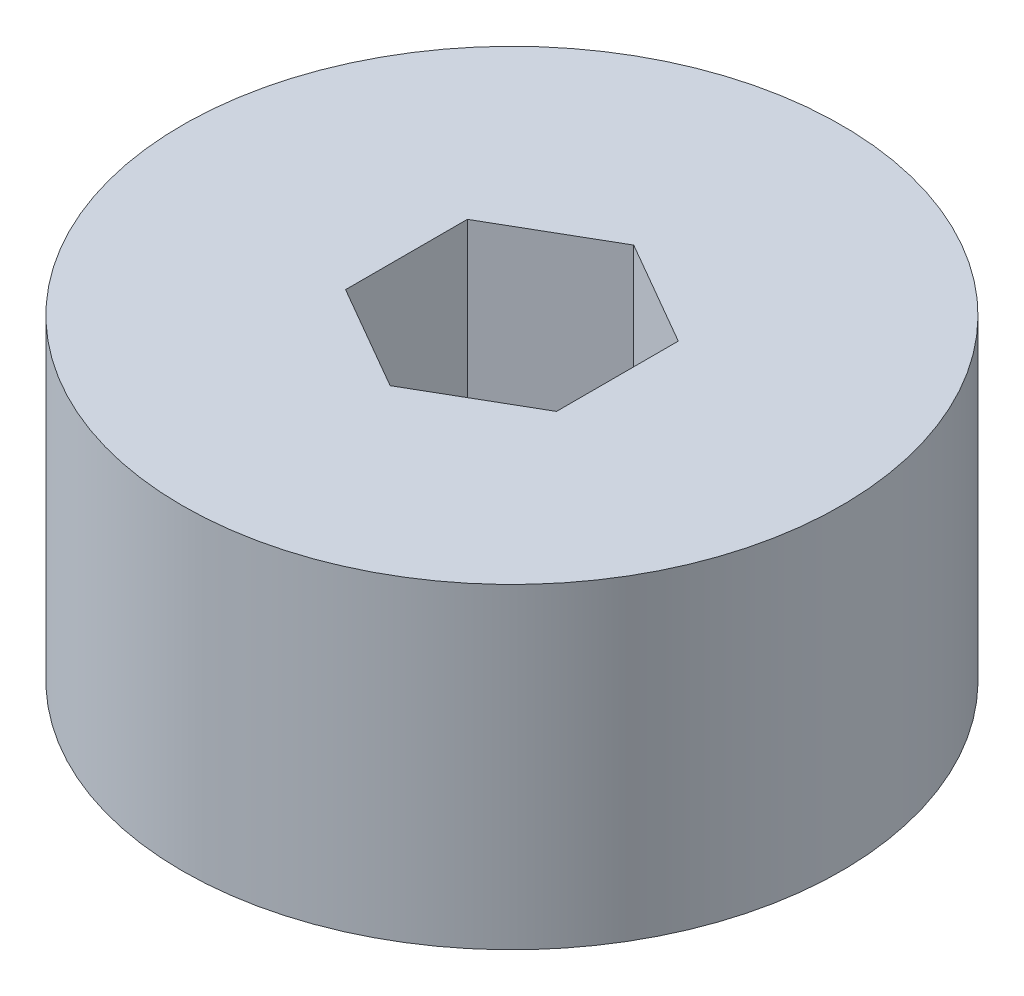
ISO-10303-21;
HEADER;
FILE_DESCRIPTION(('STEP AP214'),'2;1');
FILE_NAME('part.step','',(''),(''),'','','');
FILE_SCHEMA(('AUTOMOTIVE_DESIGN { 1 0 10303 214 1 1 1 1 }'));
ENDSEC;
DATA;
#1=APPLICATION_CONTEXT('core data for automotive mechanical design processes');
#2=APPLICATION_PROTOCOL_DEFINITION('international standard','automotive_design',2000,#1);
#3=PRODUCT_CONTEXT('',#1,'mechanical');
#4=PRODUCT('Part','Part','',(#3));
#5=PRODUCT_RELATED_PRODUCT_CATEGORY('part','',(#4));
#6=PRODUCT_DEFINITION_FORMATION('','',#4);
#7=PRODUCT_DEFINITION_CONTEXT('part definition',#1,'design');
#8=PRODUCT_DEFINITION('design','',#6,#7);
#9=PRODUCT_DEFINITION_SHAPE('','',#8);
#10=(LENGTH_UNIT() NAMED_UNIT(*) SI_UNIT(.MILLI.,.METRE.));
#11=(NAMED_UNIT(*) PLANE_ANGLE_UNIT() SI_UNIT($,.RADIAN.));
#12=(NAMED_UNIT(*) SI_UNIT($,.STERADIAN.) SOLID_ANGLE_UNIT());
#13=UNCERTAINTY_MEASURE_WITH_UNIT(LENGTH_MEASURE(1.E-05),#10,'distance_accuracy_value','');
#14=(GEOMETRIC_REPRESENTATION_CONTEXT(3) GLOBAL_UNCERTAINTY_ASSIGNED_CONTEXT((#13)) GLOBAL_UNIT_ASSIGNED_CONTEXT((#10,
#11,#12)) REPRESENTATION_CONTEXT('',''));
#15=CARTESIAN_POINT('',(0.,0.,0.));
#16=DIRECTION('',(0.,0.,1.));
#17=DIRECTION('',(1.,0.,0.));
#18=AXIS2_PLACEMENT_3D('',#15,#16,#17);
#19=CARTESIAN_POINT('',(0.,12.,0.));
#20=DIRECTION('',(0.,-1.,0.));
#21=DIRECTION('',(0.,0.,-1.));
#22=AXIS2_PLACEMENT_3D('',#19,#20,#21);
#23=CYLINDRICAL_SURFACE('',#22,12.5);
#24=CARTESIAN_POINT('',(0.,12.,0.));
#25=DIRECTION('',(0.,1.,0.));
#26=DIRECTION('',(0.,0.,1.));
#27=AXIS2_PLACEMENT_3D('',#24,#25,#26);
#28=CIRCLE('',#27,12.5);
#29=CARTESIAN_POINT('',(0.,12.,12.5));
#30=VERTEX_POINT('',#29);
#31=EDGE_CURVE('E11',#30,#30,#28,.T.);
#32=ORIENTED_EDGE('',*,*,#31,.F.);
#33=EDGE_LOOP('',(#32));
#34=FACE_BOUND('',#33,.T.);
#35=CARTESIAN_POINT('',(0.,0.,0.));
#36=DIRECTION('',(0.,1.,0.));
#37=DIRECTION('',(0.,0.,1.));
#38=AXIS2_PLACEMENT_3D('',#35,#36,#37);
#39=CIRCLE('',#38,12.5);
#40=CARTESIAN_POINT('',(0.,0.,12.5));
#41=VERTEX_POINT('',#40);
#42=EDGE_CURVE('E45',#41,#41,#39,.T.);
#43=ORIENTED_EDGE('',*,*,#42,.T.);
#44=EDGE_LOOP('',(#43));
#45=FACE_BOUND('',#44,.T.);
#46=ADVANCED_FACE('F39',(#34,#45),#23,.T.);
#47=CARTESIAN_POINT('',(0.,12.,0.));
#48=DIRECTION('',(0.,1.,0.));
#49=DIRECTION('',(0.,0.,1.));
#50=AXIS2_PLACEMENT_3D('',#47,#48,#49);
#51=PLANE('',#50);
#52=DIRECTION('',(0.866025403784439,0.,0.5));
#53=VECTOR('',#52,1.);
#54=CARTESIAN_POINT('',(-4.,12.,2.3094010767585));
#55=LINE('',#54,#53);
#56=CARTESIAN_POINT('',(-4.,12.,2.3094010767585));
#57=VERTEX_POINT('',#56);
#58=CARTESIAN_POINT('',(0.,12.,4.61880215351701));
#59=VERTEX_POINT('',#58);
#60=EDGE_CURVE('E52',#57,#59,#55,.T.);
#61=ORIENTED_EDGE('',*,*,#60,.F.);
#62=DIRECTION('',(0.,0.,1.));
#63=VECTOR('',#62,1.);
#64=CARTESIAN_POINT('',(-4.,12.,-2.3094010767585));
#65=LINE('',#64,#63);
#66=CARTESIAN_POINT('',(-4.,12.,-2.3094010767585));
#67=VERTEX_POINT('',#66);
#68=EDGE_CURVE('E137',#67,#57,#65,.T.);
#69=ORIENTED_EDGE('',*,*,#68,.F.);
#70=DIRECTION('',(-0.866025403784439,0.,0.5));
#71=VECTOR('',#70,1.);
#72=CARTESIAN_POINT('',(0.,12.,-4.61880215351701));
#73=LINE('',#72,#71);
#74=CARTESIAN_POINT('',(0.,12.,-4.61880215351701));
#75=VERTEX_POINT('',#74);
#76=EDGE_CURVE('E133',#75,#67,#73,.T.);
#77=ORIENTED_EDGE('',*,*,#76,.F.);
#78=DIRECTION('',(-0.866025403784439,0.,-0.5));
#79=VECTOR('',#78,1.);
#80=CARTESIAN_POINT('',(4.,12.,-2.30940107675851));
#81=LINE('',#80,#79);
#82=CARTESIAN_POINT('',(4.,12.,-2.30940107675851));
#83=VERTEX_POINT('',#82);
#84=EDGE_CURVE('E101',#83,#75,#81,.T.);
#85=ORIENTED_EDGE('',*,*,#84,.F.);
#86=DIRECTION('',(0.,0.,-1.));
#87=VECTOR('',#86,1.);
#88=CARTESIAN_POINT('',(4.,12.,2.3094010767585));
#89=LINE('',#88,#87);
#90=CARTESIAN_POINT('',(4.,12.,2.3094010767585));
#91=VERTEX_POINT('',#90);
#92=EDGE_CURVE('E128',#91,#83,#89,.T.);
#93=ORIENTED_EDGE('',*,*,#92,.F.);
#94=DIRECTION('',(0.866025403784439,0.,-0.5));
#95=VECTOR('',#94,1.);
#96=CARTESIAN_POINT('',(0.,12.,4.61880215351701));
#97=LINE('',#96,#95);
#98=EDGE_CURVE('E130',#59,#91,#97,.T.);
#99=ORIENTED_EDGE('',*,*,#98,.F.);
#100=EDGE_LOOP('',(#61,#69,#77,#85,#93,#99));
#101=FACE_BOUND('',#100,.T.);
#102=ORIENTED_EDGE('',*,*,#31,.T.);
#103=EDGE_LOOP('',(#102));
#104=FACE_BOUND('',#103,.T.);
#105=ADVANCED_FACE('F149',(#101,#104),#51,.T.);
#106=CARTESIAN_POINT('',(0.,0.,0.));
#107=DIRECTION('',(0.,1.,0.));
#108=DIRECTION('',(0.,0.,1.));
#109=AXIS2_PLACEMENT_3D('',#106,#107,#108);
#110=PLANE('',#109);
#111=ORIENTED_EDGE('',*,*,#42,.F.);
#112=EDGE_LOOP('',(#111));
#113=FACE_BOUND('',#112,.T.);
#114=ADVANCED_FACE('F158',(#113),#110,.F.);
#115=CARTESIAN_POINT('',(-4.,3.8,2.3094010767585));
#116=DIRECTION('',(-0.5,0.,0.866025403784439));
#117=DIRECTION('',(0.866025403784439,0.,0.5));
#118=AXIS2_PLACEMENT_3D('',#115,#116,#117);
#119=PLANE('',#118);
#120=ORIENTED_EDGE('',*,*,#60,.T.);
#121=DIRECTION('',(0.,1.,0.));
#122=VECTOR('',#121,1.);
#123=CARTESIAN_POINT('',(0.,3.8,4.61880215351701));
#124=LINE('',#123,#122);
#125=CARTESIAN_POINT('',(0.,3.8,4.61880215351701));
#126=VERTEX_POINT('',#125);
#127=EDGE_CURVE('E84',#126,#59,#124,.T.);
#128=ORIENTED_EDGE('',*,*,#127,.F.);
#129=DIRECTION('',(0.866025403784439,0.,0.5));
#130=VECTOR('',#129,1.);
#131=CARTESIAN_POINT('',(-4.,3.8,2.3094010767585));
#132=LINE('',#131,#130);
#133=CARTESIAN_POINT('',(-4.,3.8,2.3094010767585));
#134=VERTEX_POINT('',#133);
#135=EDGE_CURVE('E139',#134,#126,#132,.T.);
#136=ORIENTED_EDGE('',*,*,#135,.F.);
#137=DIRECTION('',(0.,1.,0.));
#138=VECTOR('',#137,1.);
#139=CARTESIAN_POINT('',(-4.,3.8,2.3094010767585));
#140=LINE('',#139,#138);
#141=EDGE_CURVE('E64',#134,#57,#140,.T.);
#142=ORIENTED_EDGE('',*,*,#141,.T.);
#143=EDGE_LOOP('',(#120,#128,#136,#142));
#144=FACE_BOUND('',#143,.T.);
#145=ADVANCED_FACE('F154',(#144),#119,.F.);
#146=CARTESIAN_POINT('',(-4.,3.8,-2.3094010767585));
#147=DIRECTION('',(-1.,0.,0.));
#148=DIRECTION('',(0.,0.,1.));
#149=AXIS2_PLACEMENT_3D('',#146,#147,#148);
#150=PLANE('',#149);
#151=ORIENTED_EDGE('',*,*,#68,.T.);
#152=ORIENTED_EDGE('',*,*,#141,.F.);
#153=DIRECTION('',(0.,0.,1.));
#154=VECTOR('',#153,1.);
#155=CARTESIAN_POINT('',(-4.,3.8,-2.3094010767585));
#156=LINE('',#155,#154);
#157=CARTESIAN_POINT('',(-4.,3.8,-2.3094010767585));
#158=VERTEX_POINT('',#157);
#159=EDGE_CURVE('E114',#158,#134,#156,.T.);
#160=ORIENTED_EDGE('',*,*,#159,.F.);
#161=DIRECTION('',(0.,1.,0.));
#162=VECTOR('',#161,1.);
#163=CARTESIAN_POINT('',(-4.,3.8,-2.3094010767585));
#164=LINE('',#163,#162);
#165=EDGE_CURVE('E104',#158,#67,#164,.T.);
#166=ORIENTED_EDGE('',*,*,#165,.T.);
#167=EDGE_LOOP('',(#151,#152,#160,#166));
#168=FACE_BOUND('',#167,.T.);
#169=ADVANCED_FACE('F160',(#168),#150,.F.);
#170=CARTESIAN_POINT('',(0.,3.8,-4.61880215351701));
#171=DIRECTION('',(-0.5,0.,-0.866025403784439));
#172=DIRECTION('',(-0.866025403784439,0.,0.5));
#173=AXIS2_PLACEMENT_3D('',#170,#171,#172);
#174=PLANE('',#173);
#175=ORIENTED_EDGE('',*,*,#76,.T.);
#176=ORIENTED_EDGE('',*,*,#165,.F.);
#177=DIRECTION('',(-0.866025403784439,0.,0.5));
#178=VECTOR('',#177,1.);
#179=CARTESIAN_POINT('',(0.,3.8,-4.61880215351701));
#180=LINE('',#179,#178);
#181=CARTESIAN_POINT('',(0.,3.8,-4.61880215351701));
#182=VERTEX_POINT('',#181);
#183=EDGE_CURVE('E108',#182,#158,#180,.T.);
#184=ORIENTED_EDGE('',*,*,#183,.F.);
#185=DIRECTION('',(0.,1.,0.));
#186=VECTOR('',#185,1.);
#187=CARTESIAN_POINT('',(0.,3.8,-4.61880215351701));
#188=LINE('',#187,#186);
#189=EDGE_CURVE('E94',#182,#75,#188,.T.);
#190=ORIENTED_EDGE('',*,*,#189,.T.);
#191=EDGE_LOOP('',(#175,#176,#184,#190));
#192=FACE_BOUND('',#191,.T.);
#193=ADVANCED_FACE('F109',(#192),#174,.F.);
#194=CARTESIAN_POINT('',(4.,3.8,-2.30940107675851));
#195=DIRECTION('',(0.5,0.,-0.866025403784439));
#196=DIRECTION('',(-0.866025403784439,0.,-0.5));
#197=AXIS2_PLACEMENT_3D('',#194,#195,#196);
#198=PLANE('',#197);
#199=ORIENTED_EDGE('',*,*,#84,.T.);
#200=ORIENTED_EDGE('',*,*,#189,.F.);
#201=DIRECTION('',(-0.866025403784439,0.,-0.5));
#202=VECTOR('',#201,1.);
#203=CARTESIAN_POINT('',(4.,3.8,-2.30940107675851));
#204=LINE('',#203,#202);
#205=CARTESIAN_POINT('',(4.,3.8,-2.30940107675851));
#206=VERTEX_POINT('',#205);
#207=EDGE_CURVE('E98',#206,#182,#204,.T.);
#208=ORIENTED_EDGE('',*,*,#207,.F.);
#209=DIRECTION('',(0.,1.,0.));
#210=VECTOR('',#209,1.);
#211=CARTESIAN_POINT('',(4.,3.8,-2.30940107675851));
#212=LINE('',#211,#210);
#213=EDGE_CURVE('E106',#206,#83,#212,.T.);
#214=ORIENTED_EDGE('',*,*,#213,.T.);
#215=EDGE_LOOP('',(#199,#200,#208,#214));
#216=FACE_BOUND('',#215,.T.);
#217=ADVANCED_FACE('F96',(#216),#198,.F.);
#218=CARTESIAN_POINT('',(4.,3.8,2.3094010767585));
#219=DIRECTION('',(1.,0.,0.));
#220=DIRECTION('',(0.,0.,-1.));
#221=AXIS2_PLACEMENT_3D('',#218,#219,#220);
#222=PLANE('',#221);
#223=ORIENTED_EDGE('',*,*,#92,.T.);
#224=ORIENTED_EDGE('',*,*,#213,.F.);
#225=DIRECTION('',(0.,0.,-1.));
#226=VECTOR('',#225,1.);
#227=CARTESIAN_POINT('',(4.,3.8,2.3094010767585));
#228=LINE('',#227,#226);
#229=CARTESIAN_POINT('',(4.,3.8,2.3094010767585));
#230=VERTEX_POINT('',#229);
#231=EDGE_CURVE('E118',#230,#206,#228,.T.);
#232=ORIENTED_EDGE('',*,*,#231,.F.);
#233=DIRECTION('',(0.,1.,0.));
#234=VECTOR('',#233,1.);
#235=CARTESIAN_POINT('',(4.,3.8,2.3094010767585));
#236=LINE('',#235,#234);
#237=EDGE_CURVE('E142',#230,#91,#236,.T.);
#238=ORIENTED_EDGE('',*,*,#237,.T.);
#239=EDGE_LOOP('',(#223,#224,#232,#238));
#240=FACE_BOUND('',#239,.T.);
#241=ADVANCED_FACE('F153',(#240),#222,.F.);
#242=CARTESIAN_POINT('',(0.,3.8,4.61880215351701));
#243=DIRECTION('',(0.5,0.,0.866025403784439));
#244=DIRECTION('',(0.866025403784439,0.,-0.5));
#245=AXIS2_PLACEMENT_3D('',#242,#243,#244);
#246=PLANE('',#245);
#247=ORIENTED_EDGE('',*,*,#98,.T.);
#248=ORIENTED_EDGE('',*,*,#237,.F.);
#249=DIRECTION('',(0.866025403784439,0.,-0.5));
#250=VECTOR('',#249,1.);
#251=CARTESIAN_POINT('',(0.,3.8,4.61880215351701));
#252=LINE('',#251,#250);
#253=EDGE_CURVE('E122',#126,#230,#252,.T.);
#254=ORIENTED_EDGE('',*,*,#253,.F.);
#255=ORIENTED_EDGE('',*,*,#127,.T.);
#256=EDGE_LOOP('',(#247,#248,#254,#255));
#257=FACE_BOUND('',#256,.T.);
#258=ADVANCED_FACE('F148',(#257),#246,.F.);
#259=CARTESIAN_POINT('',(0.,3.8,0.));
#260=DIRECTION('',(0.,1.,0.));
#261=DIRECTION('',(0.,0.,1.));
#262=AXIS2_PLACEMENT_3D('',#259,#260,#261);
#263=PLANE('',#262);
#264=ORIENTED_EDGE('',*,*,#135,.T.);
#265=ORIENTED_EDGE('',*,*,#253,.T.);
#266=ORIENTED_EDGE('',*,*,#231,.T.);
#267=ORIENTED_EDGE('',*,*,#207,.T.);
#268=ORIENTED_EDGE('',*,*,#183,.T.);
#269=ORIENTED_EDGE('',*,*,#159,.T.);
#270=EDGE_LOOP('',(#264,#265,#266,#267,#268,#269));
#271=FACE_BOUND('',#270,.T.);
#272=ADVANCED_FACE('F119',(#271),#263,.T.);
#273=CLOSED_SHELL('',(#46,#105,#114,#145,#169,#193,#217,#241,#258,#272));
#274=MANIFOLD_SOLID_BREP('B2',#273);
#275=ADVANCED_BREP_SHAPE_REPRESENTATION('',(#18,#274),#14);
#276=SHAPE_DEFINITION_REPRESENTATION(#9,#275);
ENDSEC;
END-ISO-10303-21;
